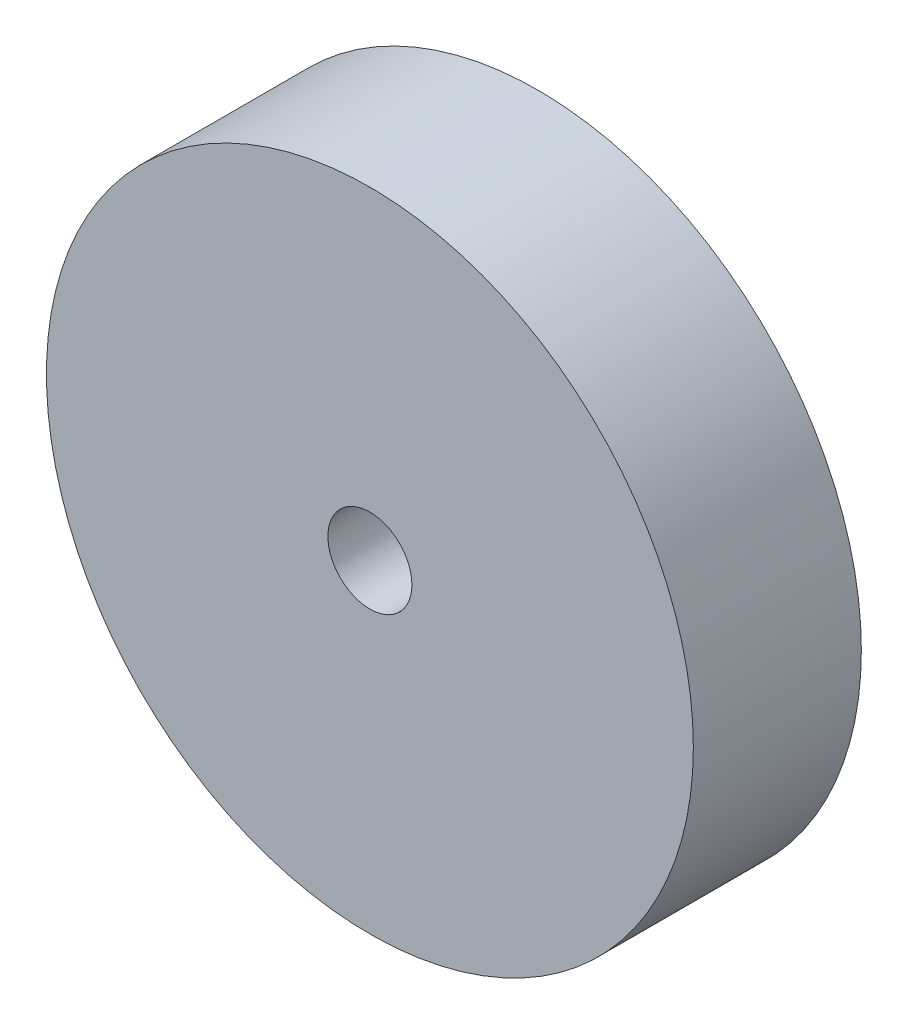
ISO-10303-21;
HEADER;
FILE_DESCRIPTION(('STEP AP214'),'2;1');
FILE_NAME('part.step','',(''),(''),'','','');
FILE_SCHEMA(('AUTOMOTIVE_DESIGN { 1 0 10303 214 1 1 1 1 }'));
ENDSEC;
DATA;
#1=APPLICATION_CONTEXT('core data for automotive mechanical design processes');
#2=APPLICATION_PROTOCOL_DEFINITION('international standard','automotive_design',2000,#1);
#3=PRODUCT_CONTEXT('',#1,'mechanical');
#4=PRODUCT('Part','Part','',(#3));
#5=PRODUCT_RELATED_PRODUCT_CATEGORY('part','',(#4));
#6=PRODUCT_DEFINITION_FORMATION('','',#4);
#7=PRODUCT_DEFINITION_CONTEXT('part definition',#1,'design');
#8=PRODUCT_DEFINITION('design','',#6,#7);
#9=PRODUCT_DEFINITION_SHAPE('','',#8);
#10=(LENGTH_UNIT() NAMED_UNIT(*) SI_UNIT(.MILLI.,.METRE.));
#11=(NAMED_UNIT(*) PLANE_ANGLE_UNIT() SI_UNIT($,.RADIAN.));
#12=(NAMED_UNIT(*) SI_UNIT($,.STERADIAN.) SOLID_ANGLE_UNIT());
#13=UNCERTAINTY_MEASURE_WITH_UNIT(LENGTH_MEASURE(1.E-05),#10,'distance_accuracy_value','');
#14=(GEOMETRIC_REPRESENTATION_CONTEXT(3) GLOBAL_UNCERTAINTY_ASSIGNED_CONTEXT((#13)) GLOBAL_UNIT_ASSIGNED_CONTEXT((#10,
#11,#12)) REPRESENTATION_CONTEXT('',''));
#15=CARTESIAN_POINT('',(0.,0.,0.));
#16=DIRECTION('',(0.,0.,1.));
#17=DIRECTION('',(1.,0.,0.));
#18=AXIS2_PLACEMENT_3D('',#15,#16,#17);
#19=CARTESIAN_POINT('',(0.,0.,2.));
#20=DIRECTION('',(0.,0.,-1.));
#21=DIRECTION('',(-1.,0.,0.));
#22=AXIS2_PLACEMENT_3D('',#19,#20,#21);
#23=CYLINDRICAL_SURFACE('',#22,3.85);
#24=CARTESIAN_POINT('',(0.,0.,2.));
#25=DIRECTION('',(0.,0.,1.));
#26=DIRECTION('',(1.,0.,0.));
#27=AXIS2_PLACEMENT_3D('',#24,#25,#26);
#28=CIRCLE('',#27,3.85);
#29=CARTESIAN_POINT('',(3.85,0.,2.));
#30=VERTEX_POINT('',#29);
#31=EDGE_CURVE('E10',#30,#30,#28,.T.);
#32=ORIENTED_EDGE('',*,*,#31,.F.);
#33=EDGE_LOOP('',(#32));
#34=FACE_BOUND('',#33,.T.);
#35=CARTESIAN_POINT('',(0.,0.,0.));
#36=DIRECTION('',(0.,0.,1.));
#37=DIRECTION('',(1.,0.,0.));
#38=AXIS2_PLACEMENT_3D('',#35,#36,#37);
#39=CIRCLE('',#38,3.85);
#40=CARTESIAN_POINT('',(3.85,0.,0.));
#41=VERTEX_POINT('',#40);
#42=EDGE_CURVE('E40',#41,#41,#39,.T.);
#43=ORIENTED_EDGE('',*,*,#42,.T.);
#44=EDGE_LOOP('',(#43));
#45=FACE_BOUND('',#44,.T.);
#46=ADVANCED_FACE('F37',(#34,#45),#23,.T.);
#47=CARTESIAN_POINT('',(0.,0.,2.));
#48=DIRECTION('',(0.,0.,1.));
#49=DIRECTION('',(1.,0.,0.));
#50=AXIS2_PLACEMENT_3D('',#47,#48,#49);
#51=PLANE('',#50);
#52=CARTESIAN_POINT('',(0.,0.,2.));
#53=DIRECTION('',(0.,0.,1.));
#54=DIRECTION('',(1.,0.,0.));
#55=AXIS2_PLACEMENT_3D('',#52,#53,#54);
#56=CIRCLE('',#55,0.5);
#57=CARTESIAN_POINT('',(0.5,0.,2.));
#58=VERTEX_POINT('',#57);
#59=EDGE_CURVE('E54',#58,#58,#56,.T.);
#60=ORIENTED_EDGE('',*,*,#59,.F.);
#61=EDGE_LOOP('',(#60));
#62=FACE_BOUND('',#61,.T.);
#63=ORIENTED_EDGE('',*,*,#31,.T.);
#64=EDGE_LOOP('',(#63));
#65=FACE_BOUND('',#64,.T.);
#66=ADVANCED_FACE('F62',(#62,#65),#51,.T.);
#67=CARTESIAN_POINT('',(0.,0.,0.));
#68=DIRECTION('',(0.,0.,1.));
#69=DIRECTION('',(1.,0.,0.));
#70=AXIS2_PLACEMENT_3D('',#67,#68,#69);
#71=PLANE('',#70);
#72=CARTESIAN_POINT('',(0.,0.,0.));
#73=DIRECTION('',(0.,0.,1.));
#74=DIRECTION('',(1.,0.,0.));
#75=AXIS2_PLACEMENT_3D('',#72,#73,#74);
#76=CIRCLE('',#75,0.5);
#77=CARTESIAN_POINT('',(0.5,0.,0.));
#78=VERTEX_POINT('',#77);
#79=EDGE_CURVE('E49',#78,#78,#76,.F.);
#80=ORIENTED_EDGE('',*,*,#79,.F.);
#81=EDGE_LOOP('',(#80));
#82=FACE_BOUND('',#81,.T.);
#83=ORIENTED_EDGE('',*,*,#42,.F.);
#84=EDGE_LOOP('',(#83));
#85=FACE_BOUND('',#84,.T.);
#86=ADVANCED_FACE('F64',(#82,#85),#71,.F.);
#87=CARTESIAN_POINT('',(0.,0.,-0.00100000000000013));
#88=DIRECTION('',(0.,0.,1.));
#89=DIRECTION('',(1.,0.,0.));
#90=AXIS2_PLACEMENT_3D('',#87,#88,#89);
#91=CYLINDRICAL_SURFACE('',#90,0.5);
#92=ORIENTED_EDGE('',*,*,#59,.T.);
#93=EDGE_LOOP('',(#92));
#94=FACE_BOUND('',#93,.T.);
#95=ORIENTED_EDGE('',*,*,#79,.T.);
#96=EDGE_LOOP('',(#95));
#97=FACE_BOUND('',#96,.T.);
#98=ADVANCED_FACE('F59',(#94,#97),#91,.F.);
#99=CLOSED_SHELL('',(#46,#66,#86,#98));
#100=MANIFOLD_SOLID_BREP('B2',#99);
#101=ADVANCED_BREP_SHAPE_REPRESENTATION('',(#18,#100),#14);
#102=SHAPE_DEFINITION_REPRESENTATION(#9,#101);
ENDSEC;
END-ISO-10303-21;
